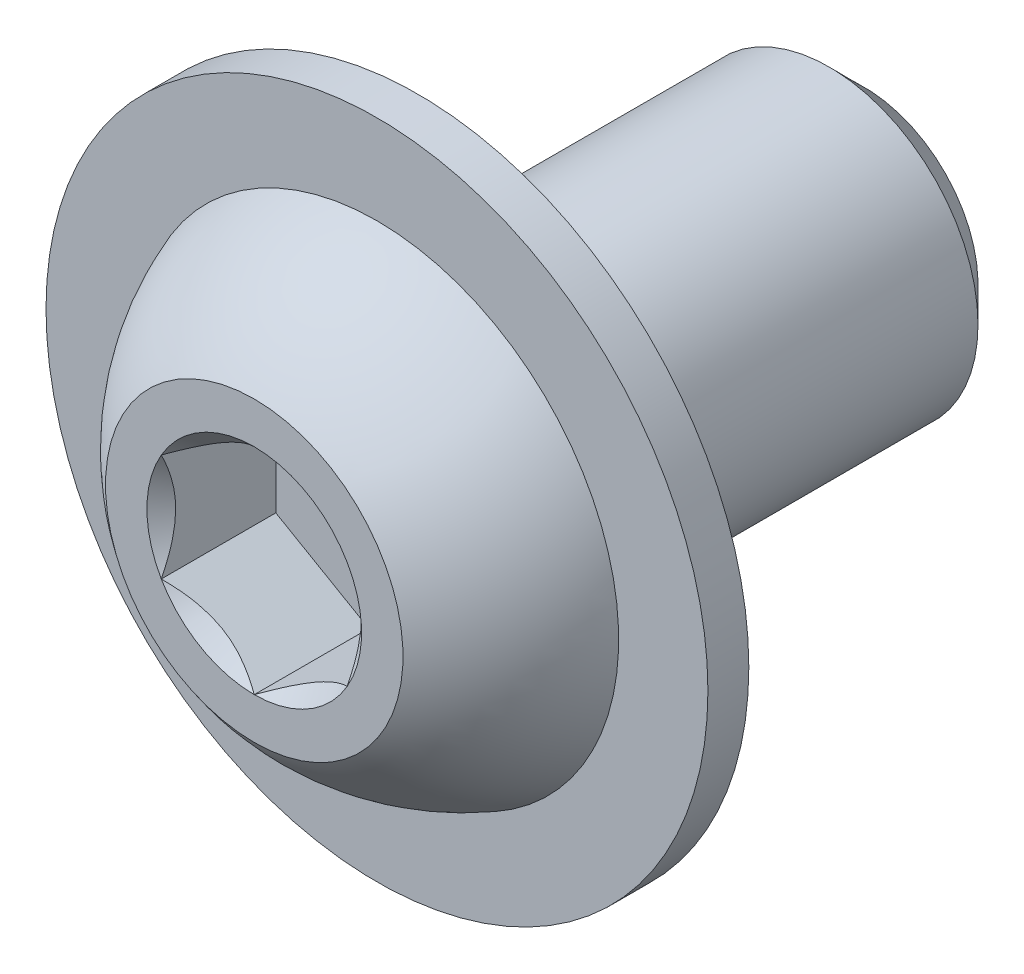
ISO-10303-21;
HEADER;
FILE_DESCRIPTION(('STEP AP214'),'2;1');
FILE_NAME('part.step','',(''),(''),'','','');
FILE_SCHEMA(('AUTOMOTIVE_DESIGN { 1 0 10303 214 1 1 1 1 }'));
ENDSEC;
DATA;
#1=APPLICATION_CONTEXT('core data for automotive mechanical design processes');
#2=APPLICATION_PROTOCOL_DEFINITION('international standard','automotive_design',2000,#1);
#3=PRODUCT_CONTEXT('',#1,'mechanical');
#4=PRODUCT('Part','Part','',(#3));
#5=PRODUCT_RELATED_PRODUCT_CATEGORY('part','',(#4));
#6=PRODUCT_DEFINITION_FORMATION('','',#4);
#7=PRODUCT_DEFINITION_CONTEXT('part definition',#1,'design');
#8=PRODUCT_DEFINITION('design','',#6,#7);
#9=PRODUCT_DEFINITION_SHAPE('','',#8);
#10=(LENGTH_UNIT() NAMED_UNIT(*) SI_UNIT(.MILLI.,.METRE.));
#11=(NAMED_UNIT(*) PLANE_ANGLE_UNIT() SI_UNIT($,.RADIAN.));
#12=(NAMED_UNIT(*) SI_UNIT($,.STERADIAN.) SOLID_ANGLE_UNIT());
#13=UNCERTAINTY_MEASURE_WITH_UNIT(LENGTH_MEASURE(1.E-05),#10,'distance_accuracy_value','');
#14=(GEOMETRIC_REPRESENTATION_CONTEXT(3) GLOBAL_UNCERTAINTY_ASSIGNED_CONTEXT((#13)) GLOBAL_UNIT_ASSIGNED_CONTEXT((#10,
#11,#12)) REPRESENTATION_CONTEXT('',''));
#15=CARTESIAN_POINT('',(0.,0.,0.));
#16=DIRECTION('',(0.,0.,1.));
#17=DIRECTION('',(1.,0.,0.));
#18=AXIS2_PLACEMENT_3D('',#15,#16,#17);
#19=CARTESIAN_POINT('',(0.,-4.00000000000001,-16.4));
#20=DIRECTION('',(0.,0.,-1.));
#21=DIRECTION('',(0.,1.,0.));
#22=AXIS2_PLACEMENT_3D('',#19,#20,#21);
#23=PLANE('',#22);
#24=CARTESIAN_POINT('',(0.,0.,-16.4));
#25=DIRECTION('',(0.,0.,-1.));
#26=DIRECTION('',(0.,1.,0.));
#27=AXIS2_PLACEMENT_3D('',#24,#25,#26);
#28=CIRCLE('',#27,3.0625);
#29=CARTESIAN_POINT('',(0.,-3.06250000000001,-16.4));
#30=VERTEX_POINT('',#29);
#31=EDGE_CURVE('E203',#30,#30,#28,.T.);
#32=ORIENTED_EDGE('',*,*,#31,.T.);
#33=EDGE_LOOP('',(#32));
#34=FACE_BOUND('',#33,.T.);
#35=ADVANCED_FACE('F41',(#34),#23,.T.);
#36=CARTESIAN_POINT('',(0.,0.,-16.4));
#37=DIRECTION('',(0.,0.,-1.));
#38=DIRECTION('',(0.,1.,0.));
#39=AXIS2_PLACEMENT_3D('',#36,#37,#38);
#40=CYLINDRICAL_SURFACE('',#39,4.00000000000001);
#41=CARTESIAN_POINT('',(0.,0.,-15.4625));
#42=DIRECTION('',(0.,0.,-1.));
#43=DIRECTION('',(0.,1.,0.));
#44=AXIS2_PLACEMENT_3D('',#41,#42,#43);
#45=CIRCLE('',#44,4.00000000000001);
#46=CARTESIAN_POINT('',(0.,-4.00000000000001,-15.4625));
#47=VERTEX_POINT('',#46);
#48=EDGE_CURVE('E56',#47,#47,#45,.F.);
#49=ORIENTED_EDGE('',*,*,#48,.T.);
#50=EDGE_LOOP('',(#49));
#51=FACE_BOUND('',#50,.T.);
#52=CARTESIAN_POINT('',(0.,0.,-4.4));
#53=DIRECTION('',(0.,0.,1.));
#54=DIRECTION('',(1.,0.,0.));
#55=AXIS2_PLACEMENT_3D('',#52,#53,#54);
#56=CIRCLE('',#55,4.00000000000001);
#57=CARTESIAN_POINT('',(4.00000000000001,0.,-4.4));
#58=VERTEX_POINT('',#57);
#59=EDGE_CURVE('E199',#58,#58,#56,.F.);
#60=ORIENTED_EDGE('',*,*,#59,.T.);
#61=EDGE_LOOP('',(#60));
#62=FACE_BOUND('',#61,.T.);
#63=ADVANCED_FACE('F210',(#51,#62),#40,.T.);
#64=CARTESIAN_POINT('',(0.,0.,-16.4));
#65=DIRECTION('',(0.,0.,1.));
#66=DIRECTION('',(0.,-1.,0.));
#67=AXIS2_PLACEMENT_3D('',#64,#65,#66);
#68=CONICAL_SURFACE('',#67,3.0625,0.785398163397448);
#69=CARTESIAN_POINT('',(0.,-4.00000000000001,-15.4625));
#70=CARTESIAN_POINT('',(0.,-3.99023437500001,-15.472265625));
#71=CARTESIAN_POINT('',(0.,-3.98046875000001,-15.48203125));
#72=CARTESIAN_POINT('',(0.,-3.96093750000001,-15.5015625));
#73=CARTESIAN_POINT('',(0.,-3.95117187500001,-15.511328125));
#74=CARTESIAN_POINT('',(0.,-3.93164062500001,-15.530859375));
#75=CARTESIAN_POINT('',(0.,-3.92187500000001,-15.540625));
#76=CARTESIAN_POINT('',(0.,-3.90234375000001,-15.56015625));
#77=CARTESIAN_POINT('',(0.,-3.89257812500001,-15.569921875));
#78=CARTESIAN_POINT('',(0.,-3.87304687500001,-15.589453125));
#79=CARTESIAN_POINT('',(0.,-3.86328125000001,-15.59921875));
#80=CARTESIAN_POINT('',(0.,-3.84375000000001,-15.61875));
#81=CARTESIAN_POINT('',(0.,-3.83398437500001,-15.628515625));
#82=CARTESIAN_POINT('',(0.,-3.81445312500001,-15.648046875));
#83=CARTESIAN_POINT('',(0.,-3.80468750000001,-15.6578125));
#84=CARTESIAN_POINT('',(0.,-3.78515625000001,-15.67734375));
#85=CARTESIAN_POINT('',(0.,-3.77539062500001,-15.687109375));
#86=CARTESIAN_POINT('',(0.,-3.75585937500001,-15.706640625));
#87=CARTESIAN_POINT('',(0.,-3.74609375000001,-15.71640625));
#88=CARTESIAN_POINT('',(0.,-3.72656250000001,-15.7359375));
#89=CARTESIAN_POINT('',(0.,-3.71679687500001,-15.745703125));
#90=CARTESIAN_POINT('',(0.,-3.69726562500001,-15.765234375));
#91=CARTESIAN_POINT('',(0.,-3.68750000000001,-15.775));
#92=CARTESIAN_POINT('',(0.,-3.66796875000001,-15.79453125));
#93=CARTESIAN_POINT('',(0.,-3.65820312500001,-15.804296875));
#94=CARTESIAN_POINT('',(0.,-3.63867187500001,-15.823828125));
#95=CARTESIAN_POINT('',(0.,-3.62890625000001,-15.83359375));
#96=CARTESIAN_POINT('',(0.,-3.60937500000001,-15.853125));
#97=CARTESIAN_POINT('',(0.,-3.59960937500001,-15.862890625));
#98=CARTESIAN_POINT('',(0.,-3.58007812500001,-15.882421875));
#99=CARTESIAN_POINT('',(0.,-3.57031250000001,-15.8921875));
#100=CARTESIAN_POINT('',(0.,-3.55078125000001,-15.91171875));
#101=CARTESIAN_POINT('',(0.,-3.54101562500001,-15.921484375));
#102=CARTESIAN_POINT('',(0.,-3.52148437500001,-15.941015625));
#103=CARTESIAN_POINT('',(0.,-3.51171875000001,-15.95078125));
#104=CARTESIAN_POINT('',(0.,-3.49218750000001,-15.9703125));
#105=CARTESIAN_POINT('',(0.,-3.48242187500001,-15.980078125));
#106=CARTESIAN_POINT('',(0.,-3.46289062500001,-15.999609375));
#107=CARTESIAN_POINT('',(0.,-3.45312500000001,-16.009375));
#108=CARTESIAN_POINT('',(0.,-3.43359375000001,-16.02890625));
#109=CARTESIAN_POINT('',(0.,-3.42382812500001,-16.038671875));
#110=CARTESIAN_POINT('',(0.,-3.40429687500001,-16.058203125));
#111=CARTESIAN_POINT('',(0.,-3.39453125000001,-16.06796875));
#112=CARTESIAN_POINT('',(0.,-3.37500000000001,-16.0875));
#113=CARTESIAN_POINT('',(0.,-3.36523437500001,-16.097265625));
#114=CARTESIAN_POINT('',(0.,-3.34570312500001,-16.116796875));
#115=CARTESIAN_POINT('',(0.,-3.33593750000001,-16.1265625));
#116=CARTESIAN_POINT('',(0.,-3.31640625000001,-16.14609375));
#117=CARTESIAN_POINT('',(0.,-3.30664062500001,-16.155859375));
#118=CARTESIAN_POINT('',(0.,-3.28710937500001,-16.175390625));
#119=CARTESIAN_POINT('',(0.,-3.27734375000001,-16.18515625));
#120=CARTESIAN_POINT('',(0.,-3.25781250000001,-16.2046875));
#121=CARTESIAN_POINT('',(0.,-3.24804687500001,-16.214453125));
#122=CARTESIAN_POINT('',(0.,-3.22851562500001,-16.233984375));
#123=CARTESIAN_POINT('',(0.,-3.21875000000001,-16.24375));
#124=CARTESIAN_POINT('',(0.,-3.19921875000001,-16.26328125));
#125=CARTESIAN_POINT('',(0.,-3.18945312500001,-16.273046875));
#126=CARTESIAN_POINT('',(0.,-3.16992187500001,-16.292578125));
#127=CARTESIAN_POINT('',(0.,-3.16015625000001,-16.30234375));
#128=CARTESIAN_POINT('',(0.,-3.14062500000001,-16.321875));
#129=CARTESIAN_POINT('',(0.,-3.13085937500001,-16.331640625));
#130=CARTESIAN_POINT('',(0.,-3.11132812500001,-16.351171875));
#131=CARTESIAN_POINT('',(0.,-3.10156250000001,-16.3609375));
#132=CARTESIAN_POINT('',(0.,-3.08203125000001,-16.38046875));
#133=CARTESIAN_POINT('',(0.,-3.07226562500001,-16.390234375));
#134=CARTESIAN_POINT('',(0.,-3.06250000000001,-16.4));
#135=B_SPLINE_CURVE_WITH_KNOTS('',3,(#69,#70,#71,#72,#73,#74,#75,#76,#77,#78,#79,#80,#81,#82,
#83,#84,#85,#86,#87,#88,#89,#90,#91,#92,#93,#94,#95,#96,#97,#98,#99,#100,#101,#102,#103,#104,
#105,#106,#107,#108,#109,#110,#111,#112,#113,#114,#115,#116,#117,#118,#119,#120,#121,#122,#123,
#124,#125,#126,#127,#128,#129,#130,#131,#132,#133,#134),.UNSPECIFIED.,.F.,.F.,(4,2,2,2,2,2,2,2,
2,2,2,2,2,2,2,2,2,2,2,2,2,2,2,2,2,2,2,2,2,2,2,2,4),(0.,0.041432037960149,0.082864075920298,
0.124296113880448,0.165728151840597,0.207160189800747,0.248592227760897,0.290024265721045,
0.331456303681195,0.372888341641345,0.414320379601495,0.455752417561643,0.497184455521793,
0.538616493481943,0.580048531442091,0.621480569402241,0.662912607362391,0.704344645322541,
0.745776683282689,0.787208721242839,0.828640759202989,0.870072797163139,0.911504835123287,
0.952936873083437,0.994368911043587,1.03580094900373,1.07723298696389,1.11866502492404,
1.16009706288419,1.20152910084433,1.24296113880448,1.28439317676463,1.32582521472478),.UNSPECIFIED.);
#136=EDGE_CURVE('BSEAM43',#47,#30,#135,.T.);
#137=ORIENTED_EDGE('',*,*,#48,.F.);
#138=ORIENTED_EDGE('',*,*,#31,.F.);
#139=ORIENTED_EDGE('',*,*,#136,.T.);
#140=ORIENTED_EDGE('',*,*,#136,.F.);
#141=EDGE_LOOP('',(#137,#139,#138,#140));
#142=FACE_BOUND('',#141,.T.);
#143=ADVANCED_FACE('F43',(#142),#68,.T.);
#144=CARTESIAN_POINT('',(0.,-6.5,-4.4));
#145=DIRECTION('',(0.,0.,1.));
#146=DIRECTION('',(1.,0.,0.));
#147=AXIS2_PLACEMENT_3D('',#144,#145,#146);
#148=PLANE('',#147);
#149=ORIENTED_EDGE('',*,*,#59,.F.);
#150=EDGE_LOOP('',(#149));
#151=FACE_BOUND('',#150,.T.);
#152=CARTESIAN_POINT('',(0.,0.,-4.4));
#153=DIRECTION('',(0.,0.,-1.));
#154=DIRECTION('',(-1.,0.,0.));
#155=AXIS2_PLACEMENT_3D('',#152,#153,#154);
#156=CIRCLE('',#155,8.9);
#157=CARTESIAN_POINT('',(-8.9,0.,-4.4));
#158=VERTEX_POINT('',#157);
#159=EDGE_CURVE('E188',#158,#158,#156,.T.);
#160=ORIENTED_EDGE('',*,*,#159,.T.);
#161=EDGE_LOOP('',(#160));
#162=FACE_BOUND('',#161,.T.);
#163=ADVANCED_FACE('F215',(#151,#162),#148,.F.);
#164=CARTESIAN_POINT('',(0.,0.,-3.3));
#165=DIRECTION('',(0.,0.,-1.));
#166=DIRECTION('',(-1.,0.,0.));
#167=AXIS2_PLACEMENT_3D('',#164,#165,#166);
#168=PLANE('',#167);
#169=CARTESIAN_POINT('',(0.,0.,-3.3));
#170=DIRECTION('',(0.,0.,-1.));
#171=DIRECTION('',(-1.,0.,0.));
#172=AXIS2_PLACEMENT_3D('',#169,#170,#171);
#173=CIRCLE('',#172,8.9);
#174=CARTESIAN_POINT('',(-8.9,0.,-3.3));
#175=VERTEX_POINT('',#174);
#176=EDGE_CURVE('E183',#175,#175,#173,.T.);
#177=ORIENTED_EDGE('',*,*,#176,.F.);
#178=EDGE_LOOP('',(#177));
#179=FACE_BOUND('',#178,.T.);
#180=CARTESIAN_POINT('',(0.,0.,-3.3));
#181=DIRECTION('',(0.,0.,-1.));
#182=DIRECTION('',(-1.,0.,0.));
#183=AXIS2_PLACEMENT_3D('',#180,#181,#182);
#184=CIRCLE('',#183,6.5);
#185=CARTESIAN_POINT('',(0.,-6.5,-3.3));
#186=VERTEX_POINT('',#185);
#187=EDGE_CURVE('E187',#186,#186,#184,.T.);
#188=ORIENTED_EDGE('',*,*,#187,.T.);
#189=EDGE_LOOP('',(#188));
#190=FACE_BOUND('',#189,.T.);
#191=ADVANCED_FACE('F233',(#179,#190),#168,.F.);
#192=CARTESIAN_POINT('',(0.,0.,-3.3));
#193=DIRECTION('',(0.,0.,-1.));
#194=DIRECTION('',(-1.,0.,0.));
#195=AXIS2_PLACEMENT_3D('',#192,#193,#194);
#196=CYLINDRICAL_SURFACE('',#195,8.9);
#197=ORIENTED_EDGE('',*,*,#176,.T.);
#198=EDGE_LOOP('',(#197));
#199=FACE_BOUND('',#198,.T.);
#200=ORIENTED_EDGE('',*,*,#159,.F.);
#201=EDGE_LOOP('',(#200));
#202=FACE_BOUND('',#201,.T.);
#203=ADVANCED_FACE('F230',(#199,#202),#196,.T.);
#204=CARTESIAN_POINT('',(0.,-4.,0.));
#205=DIRECTION('',(0.,0.,-1.));
#206=DIRECTION('',(-1.,0.,0.));
#207=AXIS2_PLACEMENT_3D('',#204,#205,#206);
#208=PLANE('',#207);
#209=CARTESIAN_POINT('',(0.,0.,0.));
#210=DIRECTION('',(0.,0.,1.));
#211=DIRECTION('',(1.,0.,0.));
#212=AXIS2_PLACEMENT_3D('',#209,#210,#211);
#213=CIRCLE('',#212,2.88675134594813);
#214=CARTESIAN_POINT('',(-2.5,1.44337567297406,0.));
#215=VERTEX_POINT('',#214);
#216=CARTESIAN_POINT('',(-2.5,-1.44337567297407,0.));
#217=VERTEX_POINT('',#216);
#218=EDGE_CURVE('E69',#215,#217,#213,.T.);
#219=ORIENTED_EDGE('',*,*,#218,.F.);
#220=CARTESIAN_POINT('',(0.,2.88675134594813,0.));
#221=VERTEX_POINT('',#220);
#222=EDGE_CURVE('E146',#221,#215,#213,.T.);
#223=ORIENTED_EDGE('',*,*,#222,.F.);
#224=CARTESIAN_POINT('',(2.5,1.44337567297407,0.));
#225=VERTEX_POINT('',#224);
#226=EDGE_CURVE('E141',#225,#221,#213,.T.);
#227=ORIENTED_EDGE('',*,*,#226,.F.);
#228=CARTESIAN_POINT('',(2.5,-1.44337567297407,0.));
#229=VERTEX_POINT('',#228);
#230=EDGE_CURVE('E110',#229,#225,#213,.T.);
#231=ORIENTED_EDGE('',*,*,#230,.F.);
#232=CARTESIAN_POINT('',(0.,-2.88675134594813,0.));
#233=VERTEX_POINT('',#232);
#234=EDGE_CURVE('E101',#233,#229,#213,.T.);
#235=ORIENTED_EDGE('',*,*,#234,.F.);
#236=EDGE_CURVE('E62',#217,#233,#213,.T.);
#237=ORIENTED_EDGE('',*,*,#236,.F.);
#238=EDGE_LOOP('',(#219,#223,#227,#231,#235,#237));
#239=FACE_BOUND('',#238,.T.);
#240=CARTESIAN_POINT('',(0.,0.,0.));
#241=DIRECTION('',(0.,0.,1.));
#242=DIRECTION('',(1.,0.,0.));
#243=AXIS2_PLACEMENT_3D('',#240,#241,#242);
#244=CIRCLE('',#243,4.);
#245=CARTESIAN_POINT('',(0.,-4.,0.));
#246=VERTEX_POINT('',#245);
#247=EDGE_CURVE('E195',#246,#246,#244,.T.);
#248=ORIENTED_EDGE('',*,*,#247,.T.);
#249=EDGE_LOOP('',(#248));
#250=FACE_BOUND('',#249,.T.);
#251=ADVANCED_FACE('F138',(#239,#250),#208,.F.);
#252=CARTESIAN_POINT('',(0.,0.,-5.62727272727272));
#253=DIRECTION('',(0.,0.,1.));
#254=DIRECTION('',(0.,-1.,0.));
#255=AXIS2_PLACEMENT_3D('',#252,#253,#254);
#256=SPHERICAL_SURFACE('',#255,6.90407114296394);
#257=CARTESIAN_POINT('',(0.,-4.,0.));
#258=CARTESIAN_POINT('',(0.,-4.03569931947399,-0.0253758633318279));
#259=CARTESIAN_POINT('',(0.,-4.07115709956288,-0.0510915255777601));
#260=CARTESIAN_POINT('',(0.,-4.14157687966568,-0.103192942177584));
#261=CARTESIAN_POINT('',(0.,-4.17653887967959,-0.129578696531476));
#262=CARTESIAN_POINT('',(0.,-4.24595439832768,-0.18301079162697));
#263=CARTESIAN_POINT('',(0.,-4.28040791696186,-0.210057132368572));
#264=CARTESIAN_POINT('',(0.,-4.34879400383595,-0.264800590218722));
#265=CARTESIAN_POINT('',(0.,-4.38272657207585,-0.29249770732727));
#266=CARTESIAN_POINT('',(0.,-4.45005846494407,-0.34853268960288));
#267=CARTESIAN_POINT('',(0.,-4.48345778957239,-0.376870554769942));
#268=CARTESIAN_POINT('',(0.,-4.54971109859742,-0.434176768103784));
#269=CARTESIAN_POINT('',(0.,-4.58256508299412,-0.463145116270563));
#270=CARTESIAN_POINT('',(0.,-4.64771581153434,-0.521701803433046));
#271=CARTESIAN_POINT('',(0.,-4.68001255567785,-0.55129014242875));
#272=CARTESIAN_POINT('',(0.,-4.74403710577244,-0.611076094180249));
#273=CARTESIAN_POINT('',(0.,-4.77576491172354,-0.641273706936044));
#274=CARTESIAN_POINT('',(0.,-4.83864009349898,-0.702267268547666));
#275=CARTESIAN_POINT('',(0.,-4.86978746932334,-0.733063217403494));
#276=CARTESIAN_POINT('',(0.,-4.93149050916261,-0.79524229681167));
#277=CARTESIAN_POINT('',(0.,-4.96204617317751,-0.826625427364017));
#278=CARTESIAN_POINT('',(0.,-5.02255472203043,-0.889967503088938));
#279=CARTESIAN_POINT('',(0.,-5.05250760686844,-0.921926448261512));
#280=CARTESIAN_POINT('',(0.,-5.1117997483301,-0.986408577586831));
#281=CARTESIAN_POINT('',(0.,-5.14113900495374,-1.01893176173958));
#282=CARTESIAN_POINT('',(0.,-5.19919326320707,-1.08453058901635));
#283=CARTESIAN_POINT('',(0.,-5.22790826483677,-1.11760623214038));
#284=CARTESIAN_POINT('',(0.,-5.28470361243003,-1.18429799724818));
#285=CARTESIAN_POINT('',(0.,-5.31278395839361,-1.21791411923195));
#286=CARTESIAN_POINT('',(0.,-5.36829982385689,-1.2856746661844));
#287=CARTESIAN_POINT('',(0.,-5.3957353433566,-1.3198190911531));
#288=CARTESIAN_POINT('',(0.,-5.44995161865278,-1.38862387684742));
#289=CARTESIAN_POINT('',(0.,-5.47673237444925,-1.42328423757306));
#290=CARTESIAN_POINT('',(0.,-5.52962942225724,-1.4931083406796));
#291=CARTESIAN_POINT('',(0.,-5.55574571426875,-1.52827208306051));
#292=CARTESIAN_POINT('',(0.,-5.60730437509618,-1.59909021304935));
#293=CARTESIAN_POINT('',(0.,-5.6327467439121,-1.63474460065728));
#294=CARTESIAN_POINT('',(0.,-5.68294834303496,-1.70653110695854));
#295=CARTESIAN_POINT('',(0.,-5.70770757334192,-1.74266322565186));
#296=CARTESIAN_POINT('',(0.,-5.75653392756863,-1.81539210694645));
#297=CARTESIAN_POINT('',(0.,-5.78060105148839,-1.8519888695477));
#298=CARTESIAN_POINT('',(0.,-5.82803447574576,-1.92563378318505));
#299=CARTESIAN_POINT('',(0.,-5.85140077608337,-1.96268193422116));
#300=CARTESIAN_POINT('',(0.,-5.89742408982233,-2.03721620576064));
#301=CARTESIAN_POINT('',(0.,-5.92008110322367,-2.07470232626402));
#302=CARTESIAN_POINT('',(0.,-5.96467763664162,-2.15009895913664));
#303=CARTESIAN_POINT('',(0.,-5.98661715665822,-2.18800947150589));
#304=CARTESIAN_POINT('',(0.,-6.02977075673878,-2.26424115679187));
#305=CARTESIAN_POINT('',(0.,-6.05098483680273,-2.30256232970862));
#306=CARTESIAN_POINT('',(0.,-6.09267987315942,-2.37960145603142));
#307=CARTESIAN_POINT('',(0.,-6.11316082945216,-2.41831940943748));
#308=CARTESIAN_POINT('',(0.,-6.1533822000158,-2.49613807295486));
#309=CARTESIAN_POINT('',(0.,-6.1731226142867,-2.53523878306617));
#310=CARTESIAN_POINT('',(0.,-6.21185575067844,-2.61380879761387));
#311=CARTESIAN_POINT('',(0.,-6.23084847279928,-2.65327810205024));
#312=CARTESIAN_POINT('',(0.,-6.26807934596919,-2.73257100921372));
#313=CARTESIAN_POINT('',(0.,-6.28631749701826,-2.77239461194081));
#314=CARTESIAN_POINT('',(0.,-6.3220326209762,-2.85238169187573));
#315=CARTESIAN_POINT('',(0.,-6.33950959388506,-2.89254516908355));
#316=CARTESIAN_POINT('',(0.,-6.37369603562553,-2.97319744900462));
#317=CARTESIAN_POINT('',(0.,-6.39040550445714,-3.01368625171787));
#318=CARTESIAN_POINT('',(0.,-6.42305086983337,-3.09497452353447));
#319=CARTESIAN_POINT('',(0.,-6.43898676637798,-3.13577399263783));
#320=CARTESIAN_POINT('',(0.,-6.47007927479222,-3.2176687968805));
#321=CARTESIAN_POINT('',(0.,-6.48523588666185,-3.25876413201981));
#322=CARTESIAN_POINT('',(0.,-6.5,-3.3));
#323=B_SPLINE_CURVE_WITH_KNOTS('',3,(#257,#258,#259,#260,#261,#262,#263,#264,#265,#266,#267,
#268,#269,#270,#271,#272,#273,#274,#275,#276,#277,#278,#279,#280,#281,#282,#283,#284,#285,#286,
#287,#288,#289,#290,#291,#292,#293,#294,#295,#296,#297,#298,#299,#300,#301,#302,#303,#304,#305,
#306,#307,#308,#309,#310,#311,#312,#313,#314,#315,#316,#317,#318,#319,#320,#321,#322),
.UNSPECIFIED.,.F.,.F.,(4,2,2,2,2,2,2,2,2,2,2,2,2,2,2,2,2,2,2,2,2,2,2,2,2,2,2,2,2,2,2,2,4),(0.,
0.131395817008156,0.262791634016312,0.394187451024467,0.525583268032623,0.65697908504078,
0.788374902048935,0.919770719057092,1.05116653606525,1.1825623530734,1.31395817008156,
1.44535398708972,1.57674980409787,1.70814562110603,1.83954143811418,1.97093725512234,
2.10233307213049,2.23372888913865,2.36512470614681,2.49652052315496,2.62791634016312,
2.75931215717127,2.89070797417943,3.02210379118759,3.15349960819574,3.2848954252039,
3.41629124221205,3.54768705922021,3.67908287622836,3.81047869323652,3.94187451024468,
4.07327032725283,4.20466614426099),.UNSPECIFIED.);
#324=EDGE_CURVE('BSEAM224',#246,#186,#323,.T.);
#325=ORIENTED_EDGE('',*,*,#247,.F.);
#326=ORIENTED_EDGE('',*,*,#187,.F.);
#327=ORIENTED_EDGE('',*,*,#324,.T.);
#328=ORIENTED_EDGE('',*,*,#324,.F.);
#329=EDGE_LOOP('',(#325,#327,#326,#328));
#330=FACE_BOUND('',#329,.T.);
#331=ADVANCED_FACE('F224',(#330),#256,.T.);
#332=CARTESIAN_POINT('',(0.,0.,0.));
#333=DIRECTION('',(0.,0.,1.));
#334=DIRECTION('',(1.,0.,0.));
#335=AXIS2_PLACEMENT_3D('',#332,#333,#334);
#336=CONICAL_SURFACE('',#335,2.88675134594813,0.78539816339745);
#337=ORIENTED_EDGE('',*,*,#230,.T.);
#338=CARTESIAN_POINT('',(2.5,-2.87868021616154,0.925964193784651));
#339=CARTESIAN_POINT('',(2.5,-2.80858751756354,0.873054769399491));
#340=CARTESIAN_POINT('',(2.5,-2.73810237384457,0.820656784806444));
#341=CARTESIAN_POINT('',(2.5,-2.59619238907469,0.717112683515217));
#342=CARTESIAN_POINT('',(2.5,-2.52476731657143,0.665966884377931));
#343=CARTESIAN_POINT('',(2.5,-2.38030019419698,0.564792497981433));
#344=CARTESIAN_POINT('',(2.5,-2.30724990359399,0.514775637784459));
#345=CARTESIAN_POINT('',(2.5,-2.15990937397294,0.416608843915505));
#346=CARTESIAN_POINT('',(2.5,-2.08561922308943,0.368458778345535));
#347=CARTESIAN_POINT('',(2.5,-1.93130274871408,0.27174655945196));
#348=CARTESIAN_POINT('',(2.5,-1.8511916849785,0.22331893253729));
#349=CARTESIAN_POINT('',(2.5,-1.68912282627168,0.129664059704142));
#350=CARTESIAN_POINT('',(2.5,-1.60716527674864,0.0844363916948265));
#351=CARTESIAN_POINT('',(2.5,-1.44137668632319,-0.00186462533073149));
#352=CARTESIAN_POINT('',(2.5,-1.35755175925796,-0.0429496273364144));
#353=CARTESIAN_POINT('',(2.5,-1.1876157775942,-0.120038133893406));
#354=CARTESIAN_POINT('',(2.5,-1.10150577924729,-0.156043939265442));
#355=CARTESIAN_POINT('',(2.5,-0.933895283730372,-0.219050255714909));
#356=CARTESIAN_POINT('',(2.5,-0.852581486652411,-0.246542279856904));
#357=CARTESIAN_POINT('',(2.5,-0.687996185051424,-0.295002885582603));
#358=CARTESIAN_POINT('',(2.5,-0.604724546085162,-0.315971017761043));
#359=CARTESIAN_POINT('',(2.5,-0.438105786501648,-0.349940004986968));
#360=CARTESIAN_POINT('',(2.5,-0.35478695737788,-0.363077366556389));
#361=CARTESIAN_POINT('',(2.5,-0.187258638268771,-0.381129805600402));
#362=CARTESIAN_POINT('',(2.5,-0.103049303891731,-0.386046296469838));
#363=CARTESIAN_POINT('',(2.5,0.0623819458555506,-0.387291925628102));
#364=CARTESIAN_POINT('',(2.5,0.143601667742496,-0.383925448289117));
#365=CARTESIAN_POINT('',(2.5,0.305344840533966,-0.369462407619085));
#366=CARTESIAN_POINT('',(2.5,0.385868223029659,-0.358365093346908));
#367=CARTESIAN_POINT('',(2.5,0.546999992477732,-0.328857921414662));
#368=CARTESIAN_POINT('',(2.5,0.627585258156381,-0.310323623169081));
#369=CARTESIAN_POINT('',(2.5,0.786991930978588,-0.266927667985933));
#370=CARTESIAN_POINT('',(2.5,0.865813485110825,-0.242066540482562));
#371=CARTESIAN_POINT('',(2.5,1.11399280220491,-0.154441088760136));
#372=CARTESIAN_POINT('',(2.5,1.27984027529456,-0.0816966645253834));
#373=CARTESIAN_POINT('',(2.5,1.52253018655038,0.039542345267844));
#374=CARTESIAN_POINT('',(2.5,1.60256472908879,0.0820714512072034));
#375=CARTESIAN_POINT('',(2.5,1.76081489282125,0.170396524152192));
#376=CARTESIAN_POINT('',(2.5,1.83903083842887,0.216191902476712));
#377=CARTESIAN_POINT('',(2.5,1.99000684607168,0.308044678728649));
#378=CARTESIAN_POINT('',(2.5,2.06284472030444,0.353975635424458));
#379=CARTESIAN_POINT('',(2.5,2.20727164736135,0.447770245386506));
#380=CARTESIAN_POINT('',(2.5,2.27886060500402,0.49563404504362));
#381=CARTESIAN_POINT('',(2.5,2.42037078548403,0.592552236318334));
#382=CARTESIAN_POINT('',(2.5,2.49030083172878,0.64159379831621));
#383=CARTESIAN_POINT('',(2.5,2.62920524991558,0.740973835189781));
#384=CARTESIAN_POINT('',(2.5,2.69817987937839,0.791311949707408));
#385=CARTESIAN_POINT('',(2.5,2.76675463365823,0.842180297682427));
#386=B_SPLINE_CURVE_WITH_KNOTS('',3,(#338,#339,#340,#341,#342,#343,#344,#345,#346,#347,#348,
#349,#350,#351,#352,#353,#354,#355,#356,#357,#358,#359,#360,#361,#362,#363,#364,#365,#366,#367,
#368,#369,#370,#371,#372,#373,#374,#375,#376,#377,#378,#379,#380,#381,#382,#383,#384,#385),
.UNSPECIFIED.,.F.,.F.,(4,2,2,2,2,2,2,2,2,2,2,2,2,2,2,2,2,2,2,2,2,2,2,4),(0.,0.263465914971114,
0.526997968323237,0.79257194327936,1.05812711983771,1.33890112548018,1.61963802629079,
1.89956181222216,2.17935838571897,2.436638876826,2.69393708705247,2.94660788173134,
3.19923523085015,3.44271854486786,3.68622551313359,3.93398926860572,4.18173229781968,
4.72334004841907,4.99521600382014,5.26704308216966,5.52534341671993,5.78366335141086,
6.03988492204046,6.29603603207541),.UNSPECIFIED.);
#387=EDGE_CURVE('E11',#229,#225,#386,.T.);
#388=ORIENTED_EDGE('',*,*,#387,.F.);
#389=EDGE_LOOP('',(#337,#388));
#390=FACE_BOUND('',#389,.T.);
#391=ADVANCED_FACE('F114',(#390),#336,.F.);
#392=ORIENTED_EDGE('',*,*,#226,.T.);
#393=CARTESIAN_POINT('',(2.5002,1.44326020292023,0.000115476981764196));
#394=CARTESIAN_POINT('',(2.41426172221224,1.49287669073469,-0.0494592946452731));
#395=CARTESIAN_POINT('',(2.32688643272425,1.5433228376411,-0.0961225186374945));
#396=CARTESIAN_POINT('',(2.14871854383441,1.64618811625259,-0.181561859961699));
#397=CARTESIAN_POINT('',(2.05790899931893,1.69861703122359,-0.220290437593998));
#398=CARTESIAN_POINT('',(1.87479587687308,1.80433744175986,-0.286633296102261));
#399=CARTESIAN_POINT('',(1.78253893547066,1.85760201171316,-0.314414331469143));
#400=CARTESIAN_POINT('',(1.59599399122371,1.96530378549009,-0.357216824089334));
#401=CARTESIAN_POINT('',(1.50171168743372,2.01973769896307,-0.372270233328656));
#402=CARTESIAN_POINT('',(1.33922174170815,2.11355131286833,-0.385852277790518));
#403=CARTESIAN_POINT('',(1.27122403211985,2.15280980880341,-0.387862900759198));
#404=CARTESIAN_POINT('',(1.13533975883078,2.23126263056549,-0.384475882812511));
#405=CARTESIAN_POINT('',(1.06745324244776,2.27045692907358,-0.379075644700179));
#406=CARTESIAN_POINT('',(0.932321211763894,2.34847544336505,-0.361174211597527));
#407=CARTESIAN_POINT('',(0.86507650024644,2.38729919566123,-0.348665072953519));
#408=CARTESIAN_POINT('',(0.731749899181801,2.46427534467604,-0.317232498044292));
#409=CARTESIAN_POINT('',(0.665667920900343,2.50242779262542,-0.298309553503181));
#410=CARTESIAN_POINT('',(0.496403653308735,2.60015256308362,-0.242132638591752));
#411=CARTESIAN_POINT('',(0.394270877777107,2.65911894852989,-0.200644168403812));
#412=CARTESIAN_POINT('',(0.244093585059491,2.74582384890657,-0.130605953276912));
#413=CARTESIAN_POINT('',(0.19460346011739,2.77439698586412,-0.105997747883926));
#414=CARTESIAN_POINT('',(0.096539936161153,2.83101398781794,-0.0545381132847642));
#415=CARTESIAN_POINT('',(0.0479659965030719,2.85905816495513,-0.0276880612206439));
#416=CARTESIAN_POINT('',(-0.000200000000000378,2.88686681600197,0.000115476981763916));
#417=B_SPLINE_CURVE_WITH_KNOTS('',3,(#393,#394,#395,#396,#397,#398,#399,#400,#401,#402,#403,
#404,#405,#406,#407,#408,#409,#410,#411,#412,#413,#414,#415,#416),.UNSPECIFIED.,.F.,.F.,(4,2,2,
2,2,2,2,2,2,2,2,4),(0.,0.333012085133924,0.667964518301397,0.997597032043299,1.32639954393844,
1.56169424147169,1.79707142102083,2.03271213522171,2.26833478775651,2.64260240809533,
2.82922877818864,3.01574133749025),.UNSPECIFIED.);
#418=EDGE_CURVE('E145',#225,#221,#417,.T.);
#419=ORIENTED_EDGE('',*,*,#418,.F.);
#420=EDGE_LOOP('',(#392,#419));
#421=FACE_BOUND('',#420,.T.);
#422=ADVANCED_FACE('F330',(#421),#336,.F.);
#423=ORIENTED_EDGE('',*,*,#222,.T.);
#424=CARTESIAN_POINT('',(0.000199999999999485,2.88686681600197,0.000115476981764065));
#425=CARTESIAN_POINT('',(-0.0857382777877653,2.83725032818751,-0.0494592946452731));
#426=CARTESIAN_POINT('',(-0.173113567275754,2.7868041812811,-0.0961225186374944));
#427=CARTESIAN_POINT('',(-0.351281456165589,2.6839389026696,-0.181561859961699));
#428=CARTESIAN_POINT('',(-0.442091000681075,2.6315099876986,-0.220290437593998));
#429=CARTESIAN_POINT('',(-0.625204123126922,2.52578957716234,-0.286633296102261));
#430=CARTESIAN_POINT('',(-0.717461064529342,2.47252500720904,-0.314414331469144));
#431=CARTESIAN_POINT('',(-0.904006008776287,2.3648232334321,-0.357216824089334));
#432=CARTESIAN_POINT('',(-0.998288312566285,2.31038931995913,-0.372270233328656));
#433=CARTESIAN_POINT('',(-1.16077825829185,2.21657570605387,-0.385852277790518));
#434=CARTESIAN_POINT('',(-1.22877596788015,2.17731721011878,-0.387862900759198));
#435=CARTESIAN_POINT('',(-1.36466024116922,2.0988643883567,-0.384475882812511));
#436=CARTESIAN_POINT('',(-1.43254675755224,2.05967008984862,-0.379075644700179));
#437=CARTESIAN_POINT('',(-1.56767878823611,1.98165157555715,-0.361174211597527));
#438=CARTESIAN_POINT('',(-1.63492349975356,1.94282782326096,-0.348665072953518));
#439=CARTESIAN_POINT('',(-1.7682501008182,1.86585167424616,-0.317232498044292));
#440=CARTESIAN_POINT('',(-1.83433207909966,1.82769922629678,-0.298309553503181));
#441=CARTESIAN_POINT('',(-2.00359634669127,1.72997445583858,-0.242132638591752));
#442=CARTESIAN_POINT('',(-2.10572912222289,1.67100807039231,-0.200644168403812));
#443=CARTESIAN_POINT('',(-2.25590641494051,1.58430317001562,-0.130605953276912));
#444=CARTESIAN_POINT('',(-2.30539653988261,1.55573003305807,-0.105997747883926));
#445=CARTESIAN_POINT('',(-2.40346006383885,1.49911303110425,-0.0545381132847649));
#446=CARTESIAN_POINT('',(-2.45203400349693,1.47106885396706,-0.0276880612206447));
#447=CARTESIAN_POINT('',(-2.5002,1.44326020292023,0.00011547698176319));
#448=B_SPLINE_CURVE_WITH_KNOTS('',3,(#424,#425,#426,#427,#428,#429,#430,#431,#432,#433,#434,
#435,#436,#437,#438,#439,#440,#441,#442,#443,#444,#445,#446,#447),.UNSPECIFIED.,.F.,.F.,(4,2,2,
2,2,2,2,2,2,2,2,4),(0.,0.333012085133924,0.667964518301398,0.997597032043301,1.32639954393844,
1.56169424147169,1.79707142102083,2.03271213522171,2.26833478775651,2.64260240809533,
2.82922877818864,3.01574133749025),.UNSPECIFIED.);
#449=EDGE_CURVE('E152',#221,#215,#448,.T.);
#450=ORIENTED_EDGE('',*,*,#449,.F.);
#451=EDGE_LOOP('',(#423,#450));
#452=FACE_BOUND('',#451,.T.);
#453=ADVANCED_FACE('F157',(#452),#336,.F.);
#454=ORIENTED_EDGE('',*,*,#218,.T.);
#455=CARTESIAN_POINT('',(-2.5,-2.87868021616154,0.925964193784653));
#456=CARTESIAN_POINT('',(-2.5,-2.80858751756355,0.873054769399493));
#457=CARTESIAN_POINT('',(-2.5,-2.73810237384458,0.820656784806447));
#458=CARTESIAN_POINT('',(-2.5,-2.59619238907469,0.717112683515219));
#459=CARTESIAN_POINT('',(-2.5,-2.52476731657143,0.665966884377933));
#460=CARTESIAN_POINT('',(-2.5,-2.38030019419698,0.564792497981435));
#461=CARTESIAN_POINT('',(-2.5,-2.307249903594,0.514775637784461));
#462=CARTESIAN_POINT('',(-2.5,-2.15990937397294,0.416608843915507));
#463=CARTESIAN_POINT('',(-2.5,-2.08561922308943,0.368458778345536));
#464=CARTESIAN_POINT('',(-2.5,-1.93130274871409,0.271746559451961));
#465=CARTESIAN_POINT('',(-2.5,-1.8511916849785,0.223318932537292));
#466=CARTESIAN_POINT('',(-2.5,-1.68912282627168,0.129664059704144));
#467=CARTESIAN_POINT('',(-2.5,-1.60716527674864,0.0844363916948282));
#468=CARTESIAN_POINT('',(-2.5,-1.44137668632319,-0.00186462533072999));
#469=CARTESIAN_POINT('',(-2.5,-1.35755175925796,-0.0429496273364133));
#470=CARTESIAN_POINT('',(-2.5,-1.18761577759421,-0.120038133893405));
#471=CARTESIAN_POINT('',(-2.5,-1.10150577924729,-0.156043939265442));
#472=CARTESIAN_POINT('',(-2.5,-0.933895283730375,-0.219050255714908));
#473=CARTESIAN_POINT('',(-2.5,-0.852581486652413,-0.246542279856903));
#474=CARTESIAN_POINT('',(-2.5,-0.687996185051426,-0.295002885582603));
#475=CARTESIAN_POINT('',(-2.5,-0.604724546085163,-0.315971017761043));
#476=CARTESIAN_POINT('',(-2.5,-0.43810578650165,-0.349940004986969));
#477=CARTESIAN_POINT('',(-2.5,-0.354786957377881,-0.363077366556389));
#478=CARTESIAN_POINT('',(-2.5,-0.187258638268772,-0.381129805600403));
#479=CARTESIAN_POINT('',(-2.5,-0.103049303891732,-0.386046296469838));
#480=CARTESIAN_POINT('',(-2.5,0.0623819458555499,-0.387291925628103));
#481=CARTESIAN_POINT('',(-2.5,0.143601667742495,-0.383925448289117));
#482=CARTESIAN_POINT('',(-2.5,0.305344840533965,-0.369462407619085));
#483=CARTESIAN_POINT('',(-2.5,0.385868223029658,-0.358365093346909));
#484=CARTESIAN_POINT('',(-2.5,0.546999992477731,-0.328857921414662));
#485=CARTESIAN_POINT('',(-2.5,0.62758525815638,-0.310323623169082));
#486=CARTESIAN_POINT('',(-2.5,0.786991930978588,-0.266927667985933));
#487=CARTESIAN_POINT('',(-2.5,0.865813485110825,-0.242066540482562));
#488=CARTESIAN_POINT('',(-2.5,1.11399280220491,-0.154441088760137));
#489=CARTESIAN_POINT('',(-2.5,1.27984027529456,-0.0816966645253842));
#490=CARTESIAN_POINT('',(-2.5,1.52253018655038,0.0395423452678436));
#491=CARTESIAN_POINT('',(-2.5,1.60256472908879,0.0820714512072034));
#492=CARTESIAN_POINT('',(-2.5,1.76081489282124,0.170396524152191));
#493=CARTESIAN_POINT('',(-2.5,1.83903083842887,0.216191902476711));
#494=CARTESIAN_POINT('',(-2.5,1.99000684607168,0.308044678728648));
#495=CARTESIAN_POINT('',(-2.5,2.06284472030444,0.353975635424458));
#496=CARTESIAN_POINT('',(-2.5,2.20727164736135,0.447770245386506));
#497=CARTESIAN_POINT('',(-2.5,2.27886060500402,0.49563404504362));
#498=CARTESIAN_POINT('',(-2.5,2.42037078548403,0.592552236318334));
#499=CARTESIAN_POINT('',(-2.5,2.49030083172878,0.64159379831621));
#500=CARTESIAN_POINT('',(-2.5,2.62920524991558,0.740973835189781));
#501=CARTESIAN_POINT('',(-2.5,2.69817987937839,0.791311949707408));
#502=CARTESIAN_POINT('',(-2.5,2.76675463365823,0.842180297682427));
#503=B_SPLINE_CURVE_WITH_KNOTS('',3,(#455,#456,#457,#458,#459,#460,#461,#462,#463,#464,#465,
#466,#467,#468,#469,#470,#471,#472,#473,#474,#475,#476,#477,#478,#479,#480,#481,#482,#483,#484,
#485,#486,#487,#488,#489,#490,#491,#492,#493,#494,#495,#496,#497,#498,#499,#500,#501,#502),
.UNSPECIFIED.,.F.,.F.,(4,2,2,2,2,2,2,2,2,2,2,2,2,2,2,2,2,2,2,2,2,2,2,4),(0.,0.263465914971114,
0.526997968323237,0.792571943279361,1.05812711983771,1.33890112548018,1.61963802629079,
1.89956181222216,2.17935838571897,2.436638876826,2.69393708705248,2.94660788173135,
3.19923523085016,3.44271854486786,3.68622551313359,3.93398926860573,4.18173229781968,
4.72334004841908,4.99521600382014,5.26704308216966,5.52534341671993,5.78366335141086,
6.03988492204047,6.29603603207541),.UNSPECIFIED.);
#504=EDGE_CURVE('E162',#215,#217,#503,.F.);
#505=ORIENTED_EDGE('',*,*,#504,.F.);
#506=EDGE_LOOP('',(#454,#505));
#507=FACE_BOUND('',#506,.T.);
#508=ADVANCED_FACE('F324',(#507),#336,.F.);
#509=ORIENTED_EDGE('',*,*,#236,.T.);
#510=CARTESIAN_POINT('',(-2.5002,-1.44326020292023,0.000115476981763761));
#511=CARTESIAN_POINT('',(-2.41426172221224,-1.49287669073469,-0.0494592946452732));
#512=CARTESIAN_POINT('',(-2.32688643272425,-1.5433228376411,-0.0961225186374944));
#513=CARTESIAN_POINT('',(-2.14871854383441,-1.64618811625259,-0.181561859961699));
#514=CARTESIAN_POINT('',(-2.05790899931893,-1.69861703122359,-0.220290437593998));
#515=CARTESIAN_POINT('',(-1.87479587687308,-1.80433744175986,-0.286633296102261));
#516=CARTESIAN_POINT('',(-1.78253893547066,-1.85760201171316,-0.314414331469143));
#517=CARTESIAN_POINT('',(-1.59599399122371,-1.96530378549009,-0.357216824089333));
#518=CARTESIAN_POINT('',(-1.50171168743372,-2.01973769896307,-0.372270233328655));
#519=CARTESIAN_POINT('',(-1.33922174170816,-2.11355131286833,-0.385852277790518));
#520=CARTESIAN_POINT('',(-1.27122403211985,-2.15280980880341,-0.387862900759198));
#521=CARTESIAN_POINT('',(-1.13533975883078,-2.23126263056549,-0.384475882812511));
#522=CARTESIAN_POINT('',(-1.06745324244776,-2.27045692907358,-0.379075644700178));
#523=CARTESIAN_POINT('',(-0.932321211763895,-2.34847544336505,-0.361174211597527));
#524=CARTESIAN_POINT('',(-0.86507650024644,-2.38729919566123,-0.348665072953518));
#525=CARTESIAN_POINT('',(-0.731749899181802,-2.46427534467604,-0.317232498044292));
#526=CARTESIAN_POINT('',(-0.665667920900343,-2.50242779262542,-0.298309553503181));
#527=CARTESIAN_POINT('',(-0.496403653308736,-2.60015256308362,-0.242132638591752));
#528=CARTESIAN_POINT('',(-0.394270877777108,-2.65911894852989,-0.200644168403812));
#529=CARTESIAN_POINT('',(-0.244093585059492,-2.74582384890657,-0.130605953276912));
#530=CARTESIAN_POINT('',(-0.194603460117391,-2.77439698586412,-0.105997747883926));
#531=CARTESIAN_POINT('',(-0.0965399361611539,-2.83101398781794,-0.0545381132847644));
#532=CARTESIAN_POINT('',(-0.0479659965030727,-2.85905816495513,-0.0276880612206441));
#533=CARTESIAN_POINT('',(0.000199999999999642,-2.88686681600197,0.000115476981763894));
#534=B_SPLINE_CURVE_WITH_KNOTS('',3,(#510,#511,#512,#513,#514,#515,#516,#517,#518,#519,#520,
#521,#522,#523,#524,#525,#526,#527,#528,#529,#530,#531,#532,#533),.UNSPECIFIED.,.F.,.F.,(4,2,2,
2,2,2,2,2,2,2,2,4),(0.,0.333012085133923,0.667964518301396,0.997597032043298,1.32639954393844,
1.56169424147168,1.79707142102083,2.03271213522171,2.2683347877565,2.64260240809533,
2.82922877818864,3.01574133749025),.UNSPECIFIED.);
#535=EDGE_CURVE('E127',#217,#233,#534,.T.);
#536=ORIENTED_EDGE('',*,*,#535,.F.);
#537=EDGE_LOOP('',(#509,#536));
#538=FACE_BOUND('',#537,.T.);
#539=ADVANCED_FACE('F263',(#538),#336,.F.);
#540=ORIENTED_EDGE('',*,*,#234,.T.);
#541=CARTESIAN_POINT('',(-0.000200000000000497,-2.88686681600197,0.000115476981764065));
#542=CARTESIAN_POINT('',(0.0857382777877645,-2.83725032818751,-0.0494592946452729));
#543=CARTESIAN_POINT('',(0.173113567275753,-2.7868041812811,-0.0961225186374943));
#544=CARTESIAN_POINT('',(0.351281456165588,-2.6839389026696,-0.181561859961699));
#545=CARTESIAN_POINT('',(0.442091000681075,-2.6315099876986,-0.220290437593998));
#546=CARTESIAN_POINT('',(0.625204123126921,-2.52578957716234,-0.286633296102262));
#547=CARTESIAN_POINT('',(0.71746106452934,-2.47252500720904,-0.314414331469144));
#548=CARTESIAN_POINT('',(0.904006008776286,-2.3648232334321,-0.357216824089334));
#549=CARTESIAN_POINT('',(0.998288312566284,-2.31038931995913,-0.372270233328656));
#550=CARTESIAN_POINT('',(1.16077825829185,-2.21657570605387,-0.385852277790519));
#551=CARTESIAN_POINT('',(1.22877596788015,-2.17731721011878,-0.387862900759199));
#552=CARTESIAN_POINT('',(1.36466024116922,-2.0988643883567,-0.384475882812512));
#553=CARTESIAN_POINT('',(1.43254675755224,-2.05967008984862,-0.37907564470018));
#554=CARTESIAN_POINT('',(1.56767878823611,-1.98165157555715,-0.361174211597528));
#555=CARTESIAN_POINT('',(1.63492349975356,-1.94282782326097,-0.348665072953519));
#556=CARTESIAN_POINT('',(1.7682501008182,-1.86585167424616,-0.317232498044293));
#557=CARTESIAN_POINT('',(1.83433207909966,-1.82769922629678,-0.298309553503182));
#558=CARTESIAN_POINT('',(2.00359634669126,-1.72997445583858,-0.242132638591753));
#559=CARTESIAN_POINT('',(2.10572912222289,-1.67100807039231,-0.200644168403813));
#560=CARTESIAN_POINT('',(2.25590641494051,-1.58430317001562,-0.130605953276913));
#561=CARTESIAN_POINT('',(2.30539653988261,-1.55573003305807,-0.105997747883927));
#562=CARTESIAN_POINT('',(2.40346006383885,-1.49911303110425,-0.0545381132847658));
#563=CARTESIAN_POINT('',(2.45203400349693,-1.47106885396706,-0.0276880612206454));
#564=CARTESIAN_POINT('',(2.5002,-1.44326020292023,0.00011547698176303));
#565=B_SPLINE_CURVE_WITH_KNOTS('',3,(#541,#542,#543,#544,#545,#546,#547,#548,#549,#550,#551,
#552,#553,#554,#555,#556,#557,#558,#559,#560,#561,#562,#563,#564),.UNSPECIFIED.,.F.,.F.,(4,2,2,
2,2,2,2,2,2,2,2,4),(0.,0.333012085133924,0.667964518301398,0.9975970320433,1.32639954393844,
1.56169424147169,1.79707142102083,2.03271213522171,2.26833478775651,2.64260240809533,
2.82922877818864,3.01574133749025),.UNSPECIFIED.);
#566=EDGE_CURVE('E105',#233,#229,#565,.T.);
#567=ORIENTED_EDGE('',*,*,#566,.F.);
#568=EDGE_LOOP('',(#540,#567));
#569=FACE_BOUND('',#568,.T.);
#570=ADVANCED_FACE('F103',(#569),#336,.F.);
#571=CARTESIAN_POINT('',(2.5,-1.44337567297406,-3.08));
#572=DIRECTION('',(0.,0.,1.));
#573=DIRECTION('',(1.,0.,0.));
#574=AXIS2_PLACEMENT_3D('',#571,#572,#573);
#575=PLANE('',#574);
#576=DIRECTION('',(0.866025403784438,0.5,0.));
#577=VECTOR('',#576,1.);
#578=CARTESIAN_POINT('',(0.,-2.88675134594813,-3.08));
#579=LINE('',#578,#577);
#580=CARTESIAN_POINT('',(0.,-2.88675134594813,-3.08));
#581=VERTEX_POINT('',#580);
#582=CARTESIAN_POINT('',(2.5,-1.44337567297406,-3.08));
#583=VERTEX_POINT('',#582);
#584=EDGE_CURVE('E126',#581,#583,#579,.T.);
#585=ORIENTED_EDGE('',*,*,#584,.T.);
#586=DIRECTION('',(0.,1.,0.));
#587=VECTOR('',#586,1.);
#588=CARTESIAN_POINT('',(2.5,-1.44337567297406,-3.08));
#589=LINE('',#588,#587);
#590=CARTESIAN_POINT('',(2.5,1.44337567297407,-3.08));
#591=VERTEX_POINT('',#590);
#592=EDGE_CURVE('E131',#583,#591,#589,.T.);
#593=ORIENTED_EDGE('',*,*,#592,.T.);
#594=DIRECTION('',(-0.866025403784439,0.5,0.));
#595=VECTOR('',#594,1.);
#596=CARTESIAN_POINT('',(2.5,1.44337567297407,-3.08));
#597=LINE('',#596,#595);
#598=CARTESIAN_POINT('',(0.,2.88675134594813,-3.08));
#599=VERTEX_POINT('',#598);
#600=EDGE_CURVE('E308',#591,#599,#597,.T.);
#601=ORIENTED_EDGE('',*,*,#600,.T.);
#602=DIRECTION('',(-0.866025403784438,-0.5,0.));
#603=VECTOR('',#602,1.);
#604=CARTESIAN_POINT('',(0.,2.88675134594813,-3.08));
#605=LINE('',#604,#603);
#606=CARTESIAN_POINT('',(-2.5,1.44337567297406,-3.08));
#607=VERTEX_POINT('',#606);
#608=EDGE_CURVE('E171',#599,#607,#605,.T.);
#609=ORIENTED_EDGE('',*,*,#608,.T.);
#610=DIRECTION('',(0.,-1.,0.));
#611=VECTOR('',#610,1.);
#612=CARTESIAN_POINT('',(-2.5,1.44337567297406,-3.08));
#613=LINE('',#612,#611);
#614=CARTESIAN_POINT('',(-2.5,-1.44337567297407,-3.08));
#615=VERTEX_POINT('',#614);
#616=EDGE_CURVE('E314',#607,#615,#613,.T.);
#617=ORIENTED_EDGE('',*,*,#616,.T.);
#618=DIRECTION('',(0.866025403784439,-0.5,0.));
#619=VECTOR('',#618,1.);
#620=CARTESIAN_POINT('',(-2.5,-1.44337567297407,-3.08));
#621=LINE('',#620,#619);
#622=EDGE_CURVE('E135',#615,#581,#621,.T.);
#623=ORIENTED_EDGE('',*,*,#622,.T.);
#624=EDGE_LOOP('',(#585,#593,#601,#609,#617,#623));
#625=FACE_BOUND('',#624,.T.);
#626=ADVANCED_FACE('F262',(#625),#575,.T.);
#627=CARTESIAN_POINT('',(2.5,-1.44337567297406,-3.08));
#628=DIRECTION('',(1.,0.,0.));
#629=DIRECTION('',(0.,0.,-1.));
#630=AXIS2_PLACEMENT_3D('',#627,#628,#629);
#631=PLANE('',#630);
#632=DIRECTION('',(0.,0.,1.));
#633=VECTOR('',#632,1.);
#634=CARTESIAN_POINT('',(2.5,-1.44337567297406,-3.08));
#635=LINE('',#634,#633);
#636=EDGE_CURVE('E122',#583,#229,#635,.T.);
#637=ORIENTED_EDGE('',*,*,#636,.T.);
#638=ORIENTED_EDGE('',*,*,#387,.T.);
#639=DIRECTION('',(0.,0.,1.));
#640=VECTOR('',#639,1.);
#641=CARTESIAN_POINT('',(2.5,1.44337567297407,-3.08));
#642=LINE('',#641,#640);
#643=EDGE_CURVE('E134',#591,#225,#642,.T.);
#644=ORIENTED_EDGE('',*,*,#643,.F.);
#645=ORIENTED_EDGE('',*,*,#592,.F.);
#646=EDGE_LOOP('',(#637,#638,#644,#645));
#647=FACE_BOUND('',#646,.T.);
#648=ADVANCED_FACE('F129',(#647),#631,.F.);
#649=CARTESIAN_POINT('',(2.5,1.44337567297407,-3.08));
#650=DIRECTION('',(0.5,0.866025403784439,0.));
#651=DIRECTION('',(-0.866025403784439,0.5,0.));
#652=AXIS2_PLACEMENT_3D('',#649,#650,#651);
#653=PLANE('',#652);
#654=ORIENTED_EDGE('',*,*,#643,.T.);
#655=ORIENTED_EDGE('',*,*,#418,.T.);
#656=DIRECTION('',(0.,0.,1.));
#657=VECTOR('',#656,1.);
#658=CARTESIAN_POINT('',(0.,2.88675134594813,-3.08));
#659=LINE('',#658,#657);
#660=EDGE_CURVE('E167',#599,#221,#659,.T.);
#661=ORIENTED_EDGE('',*,*,#660,.F.);
#662=ORIENTED_EDGE('',*,*,#600,.F.);
#663=EDGE_LOOP('',(#654,#655,#661,#662));
#664=FACE_BOUND('',#663,.T.);
#665=ADVANCED_FACE('F165',(#664),#653,.F.);
#666=CARTESIAN_POINT('',(0.,2.88675134594813,-3.08));
#667=DIRECTION('',(-0.5,0.866025403784438,0.));
#668=DIRECTION('',(-0.866025403784439,-0.5,0.));
#669=AXIS2_PLACEMENT_3D('',#666,#667,#668);
#670=PLANE('',#669);
#671=ORIENTED_EDGE('',*,*,#660,.T.);
#672=ORIENTED_EDGE('',*,*,#449,.T.);
#673=DIRECTION('',(0.,0.,1.));
#674=VECTOR('',#673,1.);
#675=CARTESIAN_POINT('',(-2.5,1.44337567297406,-3.08));
#676=LINE('',#675,#674);
#677=EDGE_CURVE('E174',#607,#215,#676,.T.);
#678=ORIENTED_EDGE('',*,*,#677,.F.);
#679=ORIENTED_EDGE('',*,*,#608,.F.);
#680=EDGE_LOOP('',(#671,#672,#678,#679));
#681=FACE_BOUND('',#680,.T.);
#682=ADVANCED_FACE('F169',(#681),#670,.F.);
#683=CARTESIAN_POINT('',(-2.5,1.44337567297406,-3.08));
#684=DIRECTION('',(-1.,0.,0.));
#685=DIRECTION('',(0.,0.,1.));
#686=AXIS2_PLACEMENT_3D('',#683,#684,#685);
#687=PLANE('',#686);
#688=ORIENTED_EDGE('',*,*,#677,.T.);
#689=ORIENTED_EDGE('',*,*,#504,.T.);
#690=DIRECTION('',(0.,0.,1.));
#691=VECTOR('',#690,1.);
#692=CARTESIAN_POINT('',(-2.5,-1.44337567297407,-3.08));
#693=LINE('',#692,#691);
#694=EDGE_CURVE('E178',#615,#217,#693,.T.);
#695=ORIENTED_EDGE('',*,*,#694,.F.);
#696=ORIENTED_EDGE('',*,*,#616,.F.);
#697=EDGE_LOOP('',(#688,#689,#695,#696));
#698=FACE_BOUND('',#697,.T.);
#699=ADVANCED_FACE('F285',(#698),#687,.F.);
#700=CARTESIAN_POINT('',(-2.5,-1.44337567297407,-3.08));
#701=DIRECTION('',(-0.5,-0.866025403784439,0.));
#702=DIRECTION('',(0.866025403784439,-0.5,0.));
#703=AXIS2_PLACEMENT_3D('',#700,#701,#702);
#704=PLANE('',#703);
#705=ORIENTED_EDGE('',*,*,#694,.T.);
#706=ORIENTED_EDGE('',*,*,#535,.T.);
#707=DIRECTION('',(0.,0.,1.));
#708=VECTOR('',#707,1.);
#709=CARTESIAN_POINT('',(0.,-2.88675134594813,-3.08));
#710=LINE('',#709,#708);
#711=EDGE_CURVE('E124',#581,#233,#710,.T.);
#712=ORIENTED_EDGE('',*,*,#711,.F.);
#713=ORIENTED_EDGE('',*,*,#622,.F.);
#714=EDGE_LOOP('',(#705,#706,#712,#713));
#715=FACE_BOUND('',#714,.T.);
#716=ADVANCED_FACE('F243',(#715),#704,.F.);
#717=CARTESIAN_POINT('',(0.,-2.88675134594813,-3.08));
#718=DIRECTION('',(0.5,-0.866025403784438,0.));
#719=DIRECTION('',(0.866025403784438,0.5,0.));
#720=AXIS2_PLACEMENT_3D('',#717,#718,#719);
#721=PLANE('',#720);
#722=ORIENTED_EDGE('',*,*,#711,.T.);
#723=ORIENTED_EDGE('',*,*,#566,.T.);
#724=ORIENTED_EDGE('',*,*,#636,.F.);
#725=ORIENTED_EDGE('',*,*,#584,.F.);
#726=EDGE_LOOP('',(#722,#723,#724,#725));
#727=FACE_BOUND('',#726,.T.);
#728=ADVANCED_FACE('F120',(#727),#721,.F.);
#729=CLOSED_SHELL('',(#35,#63,#143,#163,#191,#203,#251,#331,#391,#422,#453,#508,#539,#570,#626,
#648,#665,#682,#699,#716,#728));
#730=MANIFOLD_SOLID_BREP('B2',#729);
#731=ADVANCED_BREP_SHAPE_REPRESENTATION('',(#18,#730),#14);
#732=SHAPE_DEFINITION_REPRESENTATION(#9,#731);
ENDSEC;
END-ISO-10303-21;
